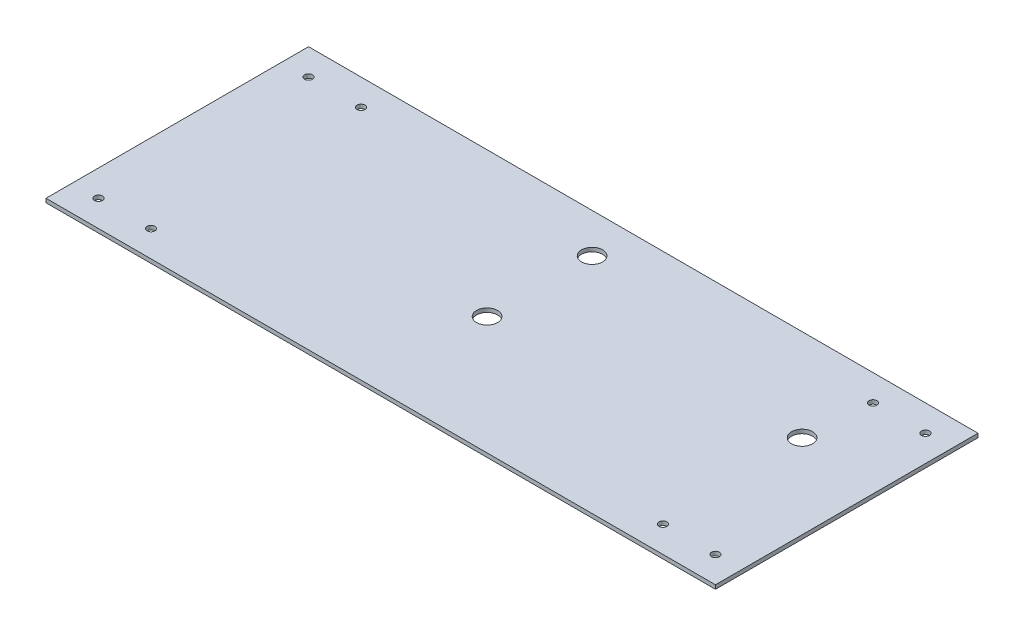
ISO-10303-21;
HEADER;
FILE_DESCRIPTION(('STEP AP214'),'2;1');
FILE_NAME('part.step','',(''),(''),'','','');
FILE_SCHEMA(('AUTOMOTIVE_DESIGN { 1 0 10303 214 1 1 1 1 }'));
ENDSEC;
DATA;
#1=APPLICATION_CONTEXT('core data for automotive mechanical design processes');
#2=APPLICATION_PROTOCOL_DEFINITION('international standard','automotive_design',2000,#1);
#3=PRODUCT_CONTEXT('',#1,'mechanical');
#4=PRODUCT('Part','Part','',(#3));
#5=PRODUCT_RELATED_PRODUCT_CATEGORY('part','',(#4));
#6=PRODUCT_DEFINITION_FORMATION('','',#4);
#7=PRODUCT_DEFINITION_CONTEXT('part definition',#1,'design');
#8=PRODUCT_DEFINITION('design','',#6,#7);
#9=PRODUCT_DEFINITION_SHAPE('','',#8);
#10=(LENGTH_UNIT() NAMED_UNIT(*) SI_UNIT(.MILLI.,.METRE.));
#11=(NAMED_UNIT(*) PLANE_ANGLE_UNIT() SI_UNIT($,.RADIAN.));
#12=(NAMED_UNIT(*) SI_UNIT($,.STERADIAN.) SOLID_ANGLE_UNIT());
#13=UNCERTAINTY_MEASURE_WITH_UNIT(LENGTH_MEASURE(1.E-05),#10,'distance_accuracy_value','');
#14=(GEOMETRIC_REPRESENTATION_CONTEXT(3) GLOBAL_UNCERTAINTY_ASSIGNED_CONTEXT((#13)) GLOBAL_UNIT_ASSIGNED_CONTEXT((#10,
#11,#12)) REPRESENTATION_CONTEXT('',''));
#15=CARTESIAN_POINT('',(0.,0.,0.));
#16=DIRECTION('',(0.,0.,1.));
#17=DIRECTION('',(1.,0.,0.));
#18=AXIS2_PLACEMENT_3D('',#15,#16,#17);
#19=CARTESIAN_POINT('',(127.5,1.5,50.));
#20=DIRECTION('',(-1.,0.,0.));
#21=DIRECTION('',(0.,0.,1.));
#22=AXIS2_PLACEMENT_3D('',#19,#20,#21);
#23=PLANE('',#22);
#24=DIRECTION('',(0.,0.,-1.));
#25=VECTOR('',#24,1.);
#26=CARTESIAN_POINT('',(127.5,0.,50.));
#27=LINE('',#26,#25);
#28=CARTESIAN_POINT('',(127.5,0.,50.));
#29=VERTEX_POINT('',#28);
#30=CARTESIAN_POINT('',(127.5,0.,-50.));
#31=VERTEX_POINT('',#30);
#32=EDGE_CURVE('E98',#29,#31,#27,.T.);
#33=ORIENTED_EDGE('',*,*,#32,.T.);
#34=DIRECTION('',(0.,-1.,0.));
#35=VECTOR('',#34,1.);
#36=CARTESIAN_POINT('',(127.5,1.5,-50.));
#37=LINE('',#36,#35);
#38=CARTESIAN_POINT('',(127.5,1.5,-50.));
#39=VERTEX_POINT('',#38);
#40=EDGE_CURVE('E11',#39,#31,#37,.T.);
#41=ORIENTED_EDGE('',*,*,#40,.F.);
#42=DIRECTION('',(0.,0.,-1.));
#43=VECTOR('',#42,1.);
#44=CARTESIAN_POINT('',(127.5,1.5,50.));
#45=LINE('',#44,#43);
#46=CARTESIAN_POINT('',(127.5,1.5,50.));
#47=VERTEX_POINT('',#46);
#48=EDGE_CURVE('E85',#47,#39,#45,.T.);
#49=ORIENTED_EDGE('',*,*,#48,.F.);
#50=DIRECTION('',(0.,-1.,0.));
#51=VECTOR('',#50,1.);
#52=CARTESIAN_POINT('',(127.5,1.5,50.));
#53=LINE('',#52,#51);
#54=EDGE_CURVE('E94',#47,#29,#53,.T.);
#55=ORIENTED_EDGE('',*,*,#54,.T.);
#56=EDGE_LOOP('',(#33,#41,#49,#55));
#57=FACE_BOUND('',#56,.T.);
#58=ADVANCED_FACE('F32',(#57),#23,.F.);
#59=CARTESIAN_POINT('',(-127.5,1.5,-50.));
#60=DIRECTION('',(0.,0.,1.));
#61=DIRECTION('',(1.,0.,0.));
#62=AXIS2_PLACEMENT_3D('',#59,#60,#61);
#63=PLANE('',#62);
#64=DIRECTION('',(-1.,0.,0.));
#65=VECTOR('',#64,1.);
#66=CARTESIAN_POINT('',(-127.5,0.,-50.));
#67=LINE('',#66,#65);
#68=CARTESIAN_POINT('',(-127.5,0.,-50.));
#69=VERTEX_POINT('',#68);
#70=EDGE_CURVE('E89',#31,#69,#67,.T.);
#71=ORIENTED_EDGE('',*,*,#70,.T.);
#72=DIRECTION('',(0.,-1.,0.));
#73=VECTOR('',#72,1.);
#74=CARTESIAN_POINT('',(-127.5,1.5,-50.));
#75=LINE('',#74,#73);
#76=CARTESIAN_POINT('',(-127.5,1.5,-50.));
#77=VERTEX_POINT('',#76);
#78=EDGE_CURVE('E41',#77,#69,#75,.T.);
#79=ORIENTED_EDGE('',*,*,#78,.F.);
#80=DIRECTION('',(-1.,0.,0.));
#81=VECTOR('',#80,1.);
#82=CARTESIAN_POINT('',(-127.5,1.5,-50.));
#83=LINE('',#82,#81);
#84=EDGE_CURVE('E80',#39,#77,#83,.T.);
#85=ORIENTED_EDGE('',*,*,#84,.F.);
#86=ORIENTED_EDGE('',*,*,#40,.T.);
#87=EDGE_LOOP('',(#71,#79,#85,#86));
#88=FACE_BOUND('',#87,.T.);
#89=ADVANCED_FACE('F88',(#88),#63,.F.);
#90=CARTESIAN_POINT('',(-127.5,1.5,50.));
#91=DIRECTION('',(1.,0.,0.));
#92=DIRECTION('',(0.,0.,-1.));
#93=AXIS2_PLACEMENT_3D('',#90,#91,#92);
#94=PLANE('',#93);
#95=DIRECTION('',(0.,0.,1.));
#96=VECTOR('',#95,1.);
#97=CARTESIAN_POINT('',(-127.5,0.,50.));
#98=LINE('',#97,#96);
#99=CARTESIAN_POINT('',(-127.5,0.,50.));
#100=VERTEX_POINT('',#99);
#101=EDGE_CURVE('E67',#69,#100,#98,.T.);
#102=ORIENTED_EDGE('',*,*,#101,.T.);
#103=DIRECTION('',(0.,-1.,0.));
#104=VECTOR('',#103,1.);
#105=CARTESIAN_POINT('',(-127.5,1.5,50.));
#106=LINE('',#105,#104);
#107=CARTESIAN_POINT('',(-127.5,1.5,50.));
#108=VERTEX_POINT('',#107);
#109=EDGE_CURVE('E90',#108,#100,#106,.T.);
#110=ORIENTED_EDGE('',*,*,#109,.F.);
#111=DIRECTION('',(0.,0.,1.));
#112=VECTOR('',#111,1.);
#113=CARTESIAN_POINT('',(-127.5,1.5,50.));
#114=LINE('',#113,#112);
#115=EDGE_CURVE('E83',#77,#108,#114,.T.);
#116=ORIENTED_EDGE('',*,*,#115,.F.);
#117=ORIENTED_EDGE('',*,*,#78,.T.);
#118=EDGE_LOOP('',(#102,#110,#116,#117));
#119=FACE_BOUND('',#118,.T.);
#120=ADVANCED_FACE('F92',(#119),#94,.F.);
#121=CARTESIAN_POINT('',(-127.5,1.5,50.));
#122=DIRECTION('',(0.,0.,-1.));
#123=DIRECTION('',(-1.,0.,0.));
#124=AXIS2_PLACEMENT_3D('',#121,#122,#123);
#125=PLANE('',#124);
#126=DIRECTION('',(1.,0.,0.));
#127=VECTOR('',#126,1.);
#128=CARTESIAN_POINT('',(-127.5,0.,50.));
#129=LINE('',#128,#127);
#130=EDGE_CURVE('E73',#100,#29,#129,.T.);
#131=ORIENTED_EDGE('',*,*,#130,.T.);
#132=ORIENTED_EDGE('',*,*,#54,.F.);
#133=DIRECTION('',(1.,0.,0.));
#134=VECTOR('',#133,1.);
#135=CARTESIAN_POINT('',(-127.5,1.5,50.));
#136=LINE('',#135,#134);
#137=EDGE_CURVE('E50',#108,#47,#136,.T.);
#138=ORIENTED_EDGE('',*,*,#137,.F.);
#139=ORIENTED_EDGE('',*,*,#109,.T.);
#140=EDGE_LOOP('',(#131,#132,#138,#139));
#141=FACE_BOUND('',#140,.T.);
#142=ADVANCED_FACE('F155',(#141),#125,.F.);
#143=CARTESIAN_POINT('',(0.,1.5,0.));
#144=DIRECTION('',(0.,-1.,0.));
#145=DIRECTION('',(0.,0.,-1.));
#146=AXIS2_PLACEMENT_3D('',#143,#144,#145);
#147=PLANE('',#146);
#148=CARTESIAN_POINT('',(95.5,1.5,-15.));
#149=DIRECTION('',(0.,1.,0.));
#150=DIRECTION('',(0.,0.,1.));
#151=AXIS2_PLACEMENT_3D('',#148,#149,#150);
#152=CIRCLE('',#151,4.00000000000001);
#153=CARTESIAN_POINT('',(95.5,1.5,-11.));
#154=VERTEX_POINT('',#153);
#155=EDGE_CURVE('E303',#154,#154,#152,.T.);
#156=ORIENTED_EDGE('',*,*,#155,.F.);
#157=EDGE_LOOP('',(#156));
#158=FACE_BOUND('',#157,.T.);
#159=CARTESIAN_POINT('',(-4.5,1.5,-35.));
#160=DIRECTION('',(0.,1.,0.));
#161=DIRECTION('',(0.,0.,1.));
#162=AXIS2_PLACEMENT_3D('',#159,#160,#161);
#163=CIRCLE('',#162,4.00000000000001);
#164=CARTESIAN_POINT('',(-4.5,1.5,-31.));
#165=VERTEX_POINT('',#164);
#166=EDGE_CURVE('E309',#165,#165,#163,.T.);
#167=ORIENTED_EDGE('',*,*,#166,.F.);
#168=EDGE_LOOP('',(#167));
#169=FACE_BOUND('',#168,.T.);
#170=CARTESIAN_POINT('',(-4.50000000000001,1.5,4.99999999999999));
#171=DIRECTION('',(0.,1.,0.));
#172=DIRECTION('',(0.,0.,1.));
#173=AXIS2_PLACEMENT_3D('',#170,#171,#172);
#174=CIRCLE('',#173,4.00000000000001);
#175=CARTESIAN_POINT('',(-4.50000000000001,1.5,9.));
#176=VERTEX_POINT('',#175);
#177=EDGE_CURVE('E317',#176,#176,#174,.T.);
#178=ORIENTED_EDGE('',*,*,#177,.F.);
#179=EDGE_LOOP('',(#178));
#180=FACE_BOUND('',#179,.T.);
#181=CARTESIAN_POINT('',(-97.5,1.5,-39.9999999999985));
#182=DIRECTION('',(0.,1.,0.));
#183=DIRECTION('',(0.,0.,1.));
#184=AXIS2_PLACEMENT_3D('',#181,#182,#183);
#185=CIRCLE('',#184,1.5);
#186=CARTESIAN_POINT('',(-97.5,1.5,-38.4999999999985));
#187=VERTEX_POINT('',#186);
#188=EDGE_CURVE('E323',#187,#187,#185,.T.);
#189=ORIENTED_EDGE('',*,*,#188,.F.);
#190=EDGE_LOOP('',(#189));
#191=FACE_BOUND('',#190,.T.);
#192=CARTESIAN_POINT('',(117.5,1.5,40.));
#193=DIRECTION('',(0.,1.,0.));
#194=DIRECTION('',(0.,0.,1.));
#195=AXIS2_PLACEMENT_3D('',#192,#193,#194);
#196=CIRCLE('',#195,1.5);
#197=CARTESIAN_POINT('',(117.5,1.5,41.5));
#198=VERTEX_POINT('',#197);
#199=EDGE_CURVE('E329',#198,#198,#196,.T.);
#200=ORIENTED_EDGE('',*,*,#199,.F.);
#201=EDGE_LOOP('',(#200));
#202=FACE_BOUND('',#201,.T.);
#203=CARTESIAN_POINT('',(97.5000000000003,1.5,40.0000000000002));
#204=DIRECTION('',(0.,1.,0.));
#205=DIRECTION('',(0.,0.,1.));
#206=AXIS2_PLACEMENT_3D('',#203,#204,#205);
#207=CIRCLE('',#206,1.5);
#208=CARTESIAN_POINT('',(97.5000000000003,1.5,41.5000000000001));
#209=VERTEX_POINT('',#208);
#210=EDGE_CURVE('E332',#209,#209,#207,.T.);
#211=ORIENTED_EDGE('',*,*,#210,.F.);
#212=EDGE_LOOP('',(#211));
#213=FACE_BOUND('',#212,.T.);
#214=CARTESIAN_POINT('',(97.5,1.5,-39.9999999999999));
#215=DIRECTION('',(0.,1.,0.));
#216=DIRECTION('',(0.,0.,1.));
#217=AXIS2_PLACEMENT_3D('',#214,#215,#216);
#218=CIRCLE('',#217,1.5);
#219=CARTESIAN_POINT('',(97.5,1.5,-38.4999999999999));
#220=VERTEX_POINT('',#219);
#221=EDGE_CURVE('E335',#220,#220,#218,.T.);
#222=ORIENTED_EDGE('',*,*,#221,.F.);
#223=EDGE_LOOP('',(#222));
#224=FACE_BOUND('',#223,.T.);
#225=CARTESIAN_POINT('',(-117.5,1.5,-39.9999999999986));
#226=DIRECTION('',(0.,1.,0.));
#227=DIRECTION('',(0.,0.,1.));
#228=AXIS2_PLACEMENT_3D('',#225,#226,#227);
#229=CIRCLE('',#228,1.5);
#230=CARTESIAN_POINT('',(-117.5,1.5,-38.4999999999986));
#231=VERTEX_POINT('',#230);
#232=EDGE_CURVE('E320',#231,#231,#229,.T.);
#233=ORIENTED_EDGE('',*,*,#232,.F.);
#234=EDGE_LOOP('',(#233));
#235=FACE_BOUND('',#234,.T.);
#236=CARTESIAN_POINT('',(-117.5,1.5,40.0000000000014));
#237=DIRECTION('',(0.,1.,0.));
#238=DIRECTION('',(0.,0.,1.));
#239=AXIS2_PLACEMENT_3D('',#236,#237,#238);
#240=CIRCLE('',#239,1.5);
#241=CARTESIAN_POINT('',(-117.5,1.5,41.5000000000014));
#242=VERTEX_POINT('',#241);
#243=EDGE_CURVE('E324',#242,#242,#240,.T.);
#244=ORIENTED_EDGE('',*,*,#243,.F.);
#245=EDGE_LOOP('',(#244));
#246=FACE_BOUND('',#245,.T.);
#247=CARTESIAN_POINT('',(-97.4999999999999,1.5,40.0000000000015));
#248=DIRECTION('',(0.,1.,0.));
#249=DIRECTION('',(0.,0.,1.));
#250=AXIS2_PLACEMENT_3D('',#247,#248,#249);
#251=CIRCLE('',#250,1.5);
#252=CARTESIAN_POINT('',(-97.4999999999999,1.5,41.5000000000015));
#253=VERTEX_POINT('',#252);
#254=EDGE_CURVE('E306',#253,#253,#251,.T.);
#255=ORIENTED_EDGE('',*,*,#254,.F.);
#256=EDGE_LOOP('',(#255));
#257=FACE_BOUND('',#256,.T.);
#258=CARTESIAN_POINT('',(117.5,1.5,-40.));
#259=DIRECTION('',(0.,1.,0.));
#260=DIRECTION('',(0.,0.,1.));
#261=AXIS2_PLACEMENT_3D('',#258,#259,#260);
#262=CIRCLE('',#261,1.5);
#263=CARTESIAN_POINT('',(117.5,1.5,-38.5));
#264=VERTEX_POINT('',#263);
#265=EDGE_CURVE('E110',#264,#264,#262,.T.);
#266=ORIENTED_EDGE('',*,*,#265,.F.);
#267=EDGE_LOOP('',(#266));
#268=FACE_BOUND('',#267,.T.);
#269=ORIENTED_EDGE('',*,*,#48,.T.);
#270=ORIENTED_EDGE('',*,*,#84,.T.);
#271=ORIENTED_EDGE('',*,*,#115,.T.);
#272=ORIENTED_EDGE('',*,*,#137,.T.);
#273=EDGE_LOOP('',(#269,#270,#271,#272));
#274=FACE_BOUND('',#273,.T.);
#275=ADVANCED_FACE('F81',(#158,#169,#180,#191,#202,#213,#224,#235,#246,#257,#268,#274),#147,.F.);
#276=CARTESIAN_POINT('',(0.,0.,0.));
#277=DIRECTION('',(0.,-1.,0.));
#278=DIRECTION('',(0.,0.,-1.));
#279=AXIS2_PLACEMENT_3D('',#276,#277,#278);
#280=PLANE('',#279);
#281=CARTESIAN_POINT('',(95.5,0.,-15.));
#282=DIRECTION('',(0.,1.,0.));
#283=DIRECTION('',(0.,0.,1.));
#284=AXIS2_PLACEMENT_3D('',#281,#282,#283);
#285=CIRCLE('',#284,4.00000000000001);
#286=CARTESIAN_POINT('',(95.5,0.,-11.));
#287=VERTEX_POINT('',#286);
#288=EDGE_CURVE('E300',#287,#287,#285,.T.);
#289=ORIENTED_EDGE('',*,*,#288,.T.);
#290=EDGE_LOOP('',(#289));
#291=FACE_BOUND('',#290,.T.);
#292=CARTESIAN_POINT('',(-4.5,0.,-35.));
#293=DIRECTION('',(0.,1.,0.));
#294=DIRECTION('',(0.,0.,1.));
#295=AXIS2_PLACEMENT_3D('',#292,#293,#294);
#296=CIRCLE('',#295,4.00000000000001);
#297=CARTESIAN_POINT('',(-4.5,0.,-31.));
#298=VERTEX_POINT('',#297);
#299=EDGE_CURVE('E304',#298,#298,#296,.T.);
#300=ORIENTED_EDGE('',*,*,#299,.T.);
#301=EDGE_LOOP('',(#300));
#302=FACE_BOUND('',#301,.T.);
#303=CARTESIAN_POINT('',(-4.50000000000001,0.,4.99999999999999));
#304=DIRECTION('',(0.,1.,0.));
#305=DIRECTION('',(0.,0.,1.));
#306=AXIS2_PLACEMENT_3D('',#303,#304,#305);
#307=CIRCLE('',#306,4.00000000000001);
#308=CARTESIAN_POINT('',(-4.50000000000001,0.,9.));
#309=VERTEX_POINT('',#308);
#310=EDGE_CURVE('E314',#309,#309,#307,.T.);
#311=ORIENTED_EDGE('',*,*,#310,.T.);
#312=EDGE_LOOP('',(#311));
#313=FACE_BOUND('',#312,.T.);
#314=CARTESIAN_POINT('',(-97.5,0.,-39.9999999999985));
#315=DIRECTION('',(0.,-1.,0.));
#316=DIRECTION('',(0.,0.,-1.));
#317=AXIS2_PLACEMENT_3D('',#314,#315,#316);
#318=CIRCLE('',#317,1.5);
#319=CARTESIAN_POINT('',(-97.5,0.,-41.4999999999985));
#320=VERTEX_POINT('',#319);
#321=EDGE_CURVE('E35',#320,#320,#318,.T.);
#322=ORIENTED_EDGE('',*,*,#321,.F.);
#323=EDGE_LOOP('',(#322));
#324=FACE_BOUND('',#323,.T.);
#325=CARTESIAN_POINT('',(117.5,0.,40.));
#326=DIRECTION('',(0.,-1.,0.));
#327=DIRECTION('',(0.,0.,-1.));
#328=AXIS2_PLACEMENT_3D('',#325,#326,#327);
#329=CIRCLE('',#328,1.5);
#330=CARTESIAN_POINT('',(117.5,0.,38.5));
#331=VERTEX_POINT('',#330);
#332=EDGE_CURVE('E124',#331,#331,#329,.T.);
#333=ORIENTED_EDGE('',*,*,#332,.F.);
#334=EDGE_LOOP('',(#333));
#335=FACE_BOUND('',#334,.T.);
#336=CARTESIAN_POINT('',(97.5000000000003,0.,40.0000000000002));
#337=DIRECTION('',(0.,-1.,0.));
#338=DIRECTION('',(0.,0.,-1.));
#339=AXIS2_PLACEMENT_3D('',#336,#337,#338);
#340=CIRCLE('',#339,1.5);
#341=CARTESIAN_POINT('',(97.5000000000003,0.,38.5000000000002));
#342=VERTEX_POINT('',#341);
#343=EDGE_CURVE('E122',#342,#342,#340,.T.);
#344=ORIENTED_EDGE('',*,*,#343,.F.);
#345=EDGE_LOOP('',(#344));
#346=FACE_BOUND('',#345,.T.);
#347=CARTESIAN_POINT('',(97.5,0.,-39.9999999999999));
#348=DIRECTION('',(0.,-1.,0.));
#349=DIRECTION('',(0.,0.,-1.));
#350=AXIS2_PLACEMENT_3D('',#347,#348,#349);
#351=CIRCLE('',#350,1.5);
#352=CARTESIAN_POINT('',(97.5,0.,-41.4999999999999));
#353=VERTEX_POINT('',#352);
#354=EDGE_CURVE('E119',#353,#353,#351,.T.);
#355=ORIENTED_EDGE('',*,*,#354,.F.);
#356=EDGE_LOOP('',(#355));
#357=FACE_BOUND('',#356,.T.);
#358=CARTESIAN_POINT('',(-117.5,0.,-39.9999999999986));
#359=DIRECTION('',(0.,-1.,0.));
#360=DIRECTION('',(0.,0.,-1.));
#361=AXIS2_PLACEMENT_3D('',#358,#359,#360);
#362=CIRCLE('',#361,1.5);
#363=CARTESIAN_POINT('',(-117.5,0.,-41.4999999999986));
#364=VERTEX_POINT('',#363);
#365=EDGE_CURVE('E116',#364,#364,#362,.T.);
#366=ORIENTED_EDGE('',*,*,#365,.F.);
#367=EDGE_LOOP('',(#366));
#368=FACE_BOUND('',#367,.T.);
#369=CARTESIAN_POINT('',(-117.5,0.,40.0000000000014));
#370=DIRECTION('',(0.,-1.,0.));
#371=DIRECTION('',(0.,0.,-1.));
#372=AXIS2_PLACEMENT_3D('',#369,#370,#371);
#373=CIRCLE('',#372,1.5);
#374=CARTESIAN_POINT('',(-117.5,0.,38.5000000000014));
#375=VERTEX_POINT('',#374);
#376=EDGE_CURVE('E113',#375,#375,#373,.T.);
#377=ORIENTED_EDGE('',*,*,#376,.F.);
#378=EDGE_LOOP('',(#377));
#379=FACE_BOUND('',#378,.T.);
#380=CARTESIAN_POINT('',(-97.4999999999999,0.,40.0000000000015));
#381=DIRECTION('',(0.,-1.,0.));
#382=DIRECTION('',(0.,0.,-1.));
#383=AXIS2_PLACEMENT_3D('',#380,#381,#382);
#384=CIRCLE('',#383,1.5);
#385=CARTESIAN_POINT('',(-97.4999999999999,0.,38.5000000000015));
#386=VERTEX_POINT('',#385);
#387=EDGE_CURVE('E109',#386,#386,#384,.T.);
#388=ORIENTED_EDGE('',*,*,#387,.F.);
#389=EDGE_LOOP('',(#388));
#390=FACE_BOUND('',#389,.T.);
#391=CARTESIAN_POINT('',(117.5,0.,-40.));
#392=DIRECTION('',(0.,-1.,0.));
#393=DIRECTION('',(0.,0.,-1.));
#394=AXIS2_PLACEMENT_3D('',#391,#392,#393);
#395=CIRCLE('',#394,1.5);
#396=CARTESIAN_POINT('',(117.5,0.,-41.5));
#397=VERTEX_POINT('',#396);
#398=EDGE_CURVE('E106',#397,#397,#395,.T.);
#399=ORIENTED_EDGE('',*,*,#398,.F.);
#400=EDGE_LOOP('',(#399));
#401=FACE_BOUND('',#400,.T.);
#402=ORIENTED_EDGE('',*,*,#32,.F.);
#403=ORIENTED_EDGE('',*,*,#130,.F.);
#404=ORIENTED_EDGE('',*,*,#101,.F.);
#405=ORIENTED_EDGE('',*,*,#70,.F.);
#406=EDGE_LOOP('',(#402,#403,#404,#405));
#407=FACE_BOUND('',#406,.T.);
#408=ADVANCED_FACE('F134',(#291,#302,#313,#324,#335,#346,#357,#368,#379,#390,#401,#407),#280,.T.);
#409=CARTESIAN_POINT('',(117.5,-8.5,-40.));
#410=DIRECTION('',(0.,1.,0.));
#411=DIRECTION('',(0.,0.,1.));
#412=AXIS2_PLACEMENT_3D('',#409,#410,#411);
#413=CYLINDRICAL_SURFACE('',#412,1.5);
#414=ORIENTED_EDGE('',*,*,#398,.T.);
#415=EDGE_LOOP('',(#414));
#416=FACE_BOUND('',#415,.T.);
#417=ORIENTED_EDGE('',*,*,#265,.T.);
#418=EDGE_LOOP('',(#417));
#419=FACE_BOUND('',#418,.T.);
#420=ADVANCED_FACE('F137',(#416,#419),#413,.F.);
#421=CARTESIAN_POINT('',(-97.4999999999999,-8.5,40.0000000000015));
#422=DIRECTION('',(0.,1.,0.));
#423=DIRECTION('',(0.,0.,1.));
#424=AXIS2_PLACEMENT_3D('',#421,#422,#423);
#425=CYLINDRICAL_SURFACE('',#424,1.5);
#426=ORIENTED_EDGE('',*,*,#387,.T.);
#427=EDGE_LOOP('',(#426));
#428=FACE_BOUND('',#427,.T.);
#429=ORIENTED_EDGE('',*,*,#254,.T.);
#430=EDGE_LOOP('',(#429));
#431=FACE_BOUND('',#430,.T.);
#432=ADVANCED_FACE('F190',(#428,#431),#425,.F.);
#433=CARTESIAN_POINT('',(-117.5,-8.5,40.0000000000014));
#434=DIRECTION('',(0.,1.,0.));
#435=DIRECTION('',(0.,0.,1.));
#436=AXIS2_PLACEMENT_3D('',#433,#434,#435);
#437=CYLINDRICAL_SURFACE('',#436,1.5);
#438=ORIENTED_EDGE('',*,*,#376,.T.);
#439=EDGE_LOOP('',(#438));
#440=FACE_BOUND('',#439,.T.);
#441=ORIENTED_EDGE('',*,*,#243,.T.);
#442=EDGE_LOOP('',(#441));
#443=FACE_BOUND('',#442,.T.);
#444=ADVANCED_FACE('F202',(#440,#443),#437,.F.);
#445=CARTESIAN_POINT('',(-117.5,-8.5,-39.9999999999986));
#446=DIRECTION('',(0.,1.,0.));
#447=DIRECTION('',(0.,0.,1.));
#448=AXIS2_PLACEMENT_3D('',#445,#446,#447);
#449=CYLINDRICAL_SURFACE('',#448,1.5);
#450=ORIENTED_EDGE('',*,*,#365,.T.);
#451=EDGE_LOOP('',(#450));
#452=FACE_BOUND('',#451,.T.);
#453=ORIENTED_EDGE('',*,*,#232,.T.);
#454=EDGE_LOOP('',(#453));
#455=FACE_BOUND('',#454,.T.);
#456=ADVANCED_FACE('F212',(#452,#455),#449,.F.);
#457=CARTESIAN_POINT('',(97.5,-8.5,-39.9999999999999));
#458=DIRECTION('',(0.,1.,0.));
#459=DIRECTION('',(0.,0.,1.));
#460=AXIS2_PLACEMENT_3D('',#457,#458,#459);
#461=CYLINDRICAL_SURFACE('',#460,1.5);
#462=ORIENTED_EDGE('',*,*,#354,.T.);
#463=EDGE_LOOP('',(#462));
#464=FACE_BOUND('',#463,.T.);
#465=ORIENTED_EDGE('',*,*,#221,.T.);
#466=EDGE_LOOP('',(#465));
#467=FACE_BOUND('',#466,.T.);
#468=ADVANCED_FACE('F222',(#464,#467),#461,.F.);
#469=CARTESIAN_POINT('',(97.5000000000003,-8.5,40.0000000000002));
#470=DIRECTION('',(0.,1.,0.));
#471=DIRECTION('',(0.,0.,1.));
#472=AXIS2_PLACEMENT_3D('',#469,#470,#471);
#473=CYLINDRICAL_SURFACE('',#472,1.5);
#474=ORIENTED_EDGE('',*,*,#343,.T.);
#475=EDGE_LOOP('',(#474));
#476=FACE_BOUND('',#475,.T.);
#477=ORIENTED_EDGE('',*,*,#210,.T.);
#478=EDGE_LOOP('',(#477));
#479=FACE_BOUND('',#478,.T.);
#480=ADVANCED_FACE('F232',(#476,#479),#473,.F.);
#481=CARTESIAN_POINT('',(117.5,-8.5,40.));
#482=DIRECTION('',(0.,1.,0.));
#483=DIRECTION('',(0.,0.,1.));
#484=AXIS2_PLACEMENT_3D('',#481,#482,#483);
#485=CYLINDRICAL_SURFACE('',#484,1.5);
#486=ORIENTED_EDGE('',*,*,#332,.T.);
#487=EDGE_LOOP('',(#486));
#488=FACE_BOUND('',#487,.T.);
#489=ORIENTED_EDGE('',*,*,#199,.T.);
#490=EDGE_LOOP('',(#489));
#491=FACE_BOUND('',#490,.T.);
#492=ADVANCED_FACE('F242',(#488,#491),#485,.F.);
#493=CARTESIAN_POINT('',(-97.5,-8.5,-39.9999999999985));
#494=DIRECTION('',(0.,1.,0.));
#495=DIRECTION('',(0.,0.,1.));
#496=AXIS2_PLACEMENT_3D('',#493,#494,#495);
#497=CYLINDRICAL_SURFACE('',#496,1.5);
#498=ORIENTED_EDGE('',*,*,#321,.T.);
#499=EDGE_LOOP('',(#498));
#500=FACE_BOUND('',#499,.T.);
#501=ORIENTED_EDGE('',*,*,#188,.T.);
#502=EDGE_LOOP('',(#501));
#503=FACE_BOUND('',#502,.T.);
#504=ADVANCED_FACE('F131',(#500,#503),#497,.F.);
#505=CARTESIAN_POINT('',(-4.50000000000001,0.,4.99999999999999));
#506=DIRECTION('',(0.,1.,0.));
#507=DIRECTION('',(0.,0.,1.));
#508=AXIS2_PLACEMENT_3D('',#505,#506,#507);
#509=CYLINDRICAL_SURFACE('',#508,4.00000000000001);
#510=ORIENTED_EDGE('',*,*,#310,.F.);
#511=EDGE_LOOP('',(#510));
#512=FACE_BOUND('',#511,.T.);
#513=ORIENTED_EDGE('',*,*,#177,.T.);
#514=EDGE_LOOP('',(#513));
#515=FACE_BOUND('',#514,.T.);
#516=ADVANCED_FACE('F259',(#512,#515),#509,.F.);
#517=CARTESIAN_POINT('',(-4.5,0.,-35.));
#518=DIRECTION('',(0.,1.,0.));
#519=DIRECTION('',(0.,0.,1.));
#520=AXIS2_PLACEMENT_3D('',#517,#518,#519);
#521=CYLINDRICAL_SURFACE('',#520,4.00000000000001);
#522=ORIENTED_EDGE('',*,*,#299,.F.);
#523=EDGE_LOOP('',(#522));
#524=FACE_BOUND('',#523,.T.);
#525=ORIENTED_EDGE('',*,*,#166,.T.);
#526=EDGE_LOOP('',(#525));
#527=FACE_BOUND('',#526,.T.);
#528=ADVANCED_FACE('F273',(#524,#527),#521,.F.);
#529=CARTESIAN_POINT('',(95.5,0.,-15.));
#530=DIRECTION('',(0.,1.,0.));
#531=DIRECTION('',(0.,0.,1.));
#532=AXIS2_PLACEMENT_3D('',#529,#530,#531);
#533=CYLINDRICAL_SURFACE('',#532,4.00000000000001);
#534=ORIENTED_EDGE('',*,*,#288,.F.);
#535=EDGE_LOOP('',(#534));
#536=FACE_BOUND('',#535,.T.);
#537=ORIENTED_EDGE('',*,*,#155,.T.);
#538=EDGE_LOOP('',(#537));
#539=FACE_BOUND('',#538,.T.);
#540=ADVANCED_FACE('F283',(#536,#539),#533,.F.);
#541=CLOSED_SHELL('',(#58,#89,#120,#142,#275,#408,#420,#432,#444,#456,#468,#480,#492,#504,#516,
#528,#540));
#542=MANIFOLD_SOLID_BREP('B2',#541);
#543=ADVANCED_BREP_SHAPE_REPRESENTATION('',(#18,#542),#14);
#544=SHAPE_DEFINITION_REPRESENTATION(#9,#543);
ENDSEC;
END-ISO-10303-21;
